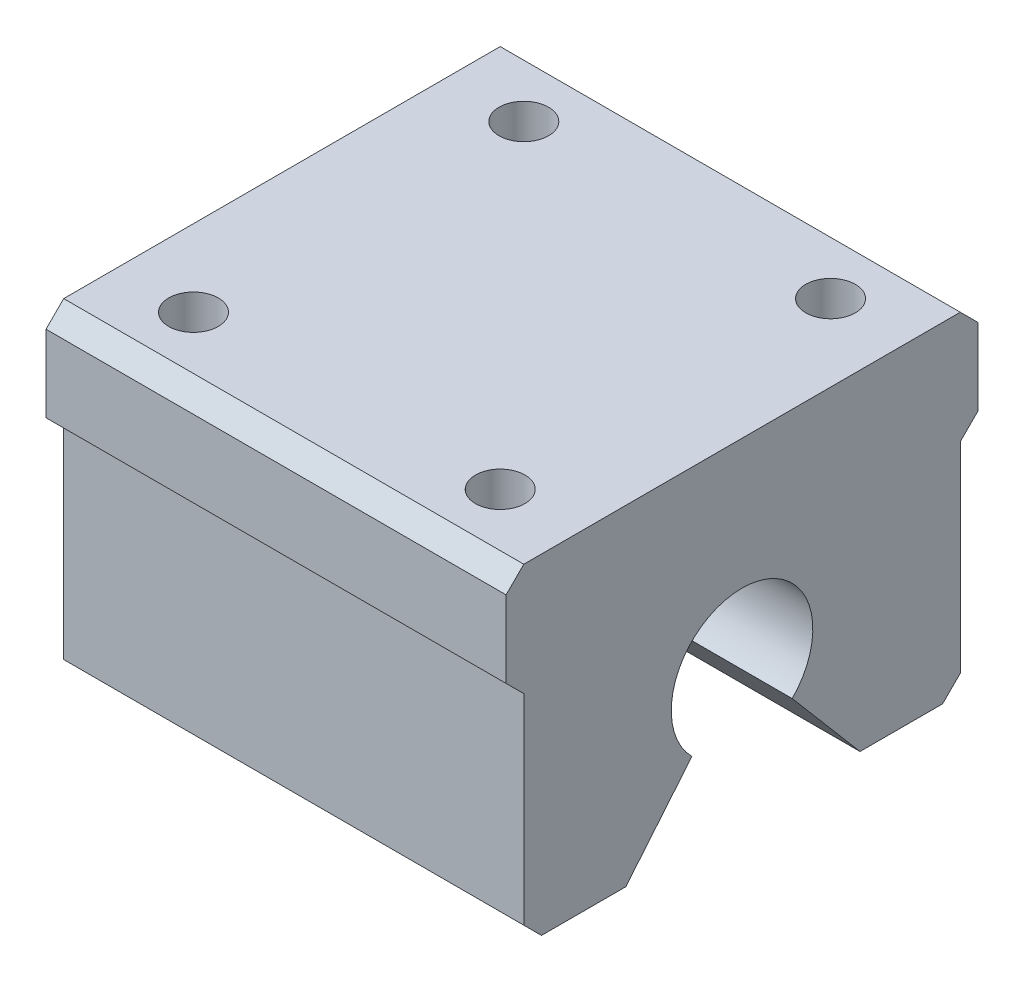
ISO-10303-21;
HEADER;
FILE_DESCRIPTION(('STEP AP214'),'2;1');
FILE_NAME('part.step','',(''),(''),'','','');
FILE_SCHEMA(('AUTOMOTIVE_DESIGN { 1 0 10303 214 1 1 1 1 }'));
ENDSEC;
DATA;
#1=APPLICATION_CONTEXT('core data for automotive mechanical design processes');
#2=APPLICATION_PROTOCOL_DEFINITION('international standard','automotive_design',2000,#1);
#3=PRODUCT_CONTEXT('',#1,'mechanical');
#4=PRODUCT('Part','Part','',(#3));
#5=PRODUCT_RELATED_PRODUCT_CATEGORY('part','',(#4));
#6=PRODUCT_DEFINITION_FORMATION('','',#4);
#7=PRODUCT_DEFINITION_CONTEXT('part definition',#1,'design');
#8=PRODUCT_DEFINITION('design','',#6,#7);
#9=PRODUCT_DEFINITION_SHAPE('','',#8);
#10=(LENGTH_UNIT() NAMED_UNIT(*) SI_UNIT(.MILLI.,.METRE.));
#11=(NAMED_UNIT(*) PLANE_ANGLE_UNIT() SI_UNIT($,.RADIAN.));
#12=(NAMED_UNIT(*) SI_UNIT($,.STERADIAN.) SOLID_ANGLE_UNIT());
#13=UNCERTAINTY_MEASURE_WITH_UNIT(LENGTH_MEASURE(1.E-05),#10,'distance_accuracy_value','');
#14=(GEOMETRIC_REPRESENTATION_CONTEXT(3) GLOBAL_UNCERTAINTY_ASSIGNED_CONTEXT((#13)) GLOBAL_UNIT_ASSIGNED_CONTEXT((#10,
#11,#12)) REPRESENTATION_CONTEXT('',''));
#15=CARTESIAN_POINT('',(0.,0.,0.));
#16=DIRECTION('',(0.,0.,1.));
#17=DIRECTION('',(1.,0.,0.));
#18=AXIS2_PLACEMENT_3D('',#15,#16,#17);
#19=CARTESIAN_POINT('',(-12.9498148707151,-18.5,-11.0177709614055));
#20=DIRECTION('',(0.,1.,0.));
#21=DIRECTION('',(0.,0.,1.));
#22=AXIS2_PLACEMENT_3D('',#19,#20,#21);
#23=PLANE('',#22);
#24=DIRECTION('',(0.,0.,-1.));
#25=VECTOR('',#24,1.);
#26=CARTESIAN_POINT('',(-12.9498148707151,-18.5,-11.0177709614055));
#27=LINE('',#26,#25);
#28=CARTESIAN_POINT('',(-12.9498148707151,-18.5,24.4822290385945));
#29=VERTEX_POINT('',#28);
#30=CARTESIAN_POINT('',(-12.9498148707151,-18.5,17.335579002308));
#31=VERTEX_POINT('',#30);
#32=EDGE_CURVE('E221',#29,#31,#27,.T.);
#33=ORIENTED_EDGE('',*,*,#32,.T.);
#34=DIRECTION('',(-1.,0.,0.));
#35=VECTOR('',#34,1.);
#36=CARTESIAN_POINT('',(26.0501851292849,-18.5,17.335579002308));
#37=LINE('',#36,#35);
#38=CARTESIAN_POINT('',(26.0501851292849,-18.5,17.335579002308));
#39=VERTEX_POINT('',#38);
#40=EDGE_CURVE('E188',#39,#31,#37,.T.);
#41=ORIENTED_EDGE('',*,*,#40,.F.);
#42=DIRECTION('',(0.,0.,1.));
#43=VECTOR('',#42,1.);
#44=CARTESIAN_POINT('',(26.0501851292849,-18.5,25.9822290385945));
#45=LINE('',#44,#43);
#46=CARTESIAN_POINT('',(26.0501851292849,-18.5,24.4822290385945));
#47=VERTEX_POINT('',#46);
#48=EDGE_CURVE('E217',#39,#47,#45,.T.);
#49=ORIENTED_EDGE('',*,*,#48,.T.);
#50=DIRECTION('',(-1.,0.,0.));
#51=VECTOR('',#50,1.);
#52=CARTESIAN_POINT('',(-12.9498148707151,-18.5,24.4822290385945));
#53=LINE('',#52,#51);
#54=EDGE_CURVE('E293',#47,#29,#53,.T.);
#55=ORIENTED_EDGE('',*,*,#54,.T.);
#56=EDGE_LOOP('',(#33,#41,#49,#55));
#57=FACE_BOUND('',#56,.T.);
#58=ADVANCED_FACE('F34',(#57),#23,.F.);
#59=CARTESIAN_POINT('',(-12.9498148707151,9.5,-12.5177709614055));
#60=DIRECTION('',(1.,0.,0.));
#61=DIRECTION('',(0.,0.,-1.));
#62=AXIS2_PLACEMENT_3D('',#59,#60,#61);
#63=PLANE('',#62);
#64=CARTESIAN_POINT('',(-12.9498148707151,-7.5,7.48222903859451));
#65=DIRECTION('',(-1.,0.,0.));
#66=DIRECTION('',(0.,0.,1.));
#67=AXIS2_PLACEMENT_3D('',#64,#65,#66);
#68=CIRCLE('',#67,6.);
#69=CARTESIAN_POINT('',(-12.9498148707151,-11.7352685865244,11.7322290385945));
#70=VERTEX_POINT('',#69);
#71=CARTESIAN_POINT('',(-12.9498148707151,-11.7352685865244,3.2322290385945));
#72=VERTEX_POINT('',#71);
#73=EDGE_CURVE('E166',#70,#72,#68,.T.);
#74=ORIENTED_EDGE('',*,*,#73,.F.);
#75=DIRECTION('',(0.,0.770117371311629,-0.637902213825965));
#76=VECTOR('',#75,1.);
#77=CARTESIAN_POINT('',(-12.9498148707151,-11.7352685865244,11.7322290385945));
#78=LINE('',#77,#76);
#79=EDGE_CURVE('E177',#31,#70,#78,.T.);
#80=ORIENTED_EDGE('',*,*,#79,.F.);
#81=ORIENTED_EDGE('',*,*,#32,.F.);
#82=DIRECTION('',(0.,-0.707106781186549,-0.707106781186546));
#83=VECTOR('',#82,1.);
#84=CARTESIAN_POINT('',(-12.9498148707151,-18.5,24.4822290385945));
#85=LINE('',#84,#83);
#86=CARTESIAN_POINT('',(-12.9498148707151,-17.,25.9822290385945));
#87=VERTEX_POINT('',#86);
#88=EDGE_CURVE('E299',#29,#87,#85,.F.);
#89=ORIENTED_EDGE('',*,*,#88,.T.);
#90=DIRECTION('',(0.,1.,0.));
#91=VECTOR('',#90,1.);
#92=CARTESIAN_POINT('',(-12.9498148707151,-18.5,25.9822290385945));
#93=LINE('',#92,#91);
#94=CARTESIAN_POINT('',(-12.9498148707151,0.,25.9822290385945));
#95=VERTEX_POINT('',#94);
#96=EDGE_CURVE('E226',#87,#95,#93,.T.);
#97=ORIENTED_EDGE('',*,*,#96,.T.);
#98=DIRECTION('',(0.,-0.707106781186546,-0.707106781186549));
#99=VECTOR('',#98,1.);
#100=CARTESIAN_POINT('',(-12.9498148707151,1.5,27.4822290385945));
#101=LINE('',#100,#99);
#102=CARTESIAN_POINT('',(-12.9498148707151,1.5,27.4822290385945));
#103=VERTEX_POINT('',#102);
#104=EDGE_CURVE('E259',#95,#103,#101,.F.);
#105=ORIENTED_EDGE('',*,*,#104,.T.);
#106=DIRECTION('',(0.,-1.,0.));
#107=VECTOR('',#106,1.);
#108=CARTESIAN_POINT('',(-12.9498148707151,9.5,27.4822290385945));
#109=LINE('',#108,#107);
#110=CARTESIAN_POINT('',(-12.9498148707151,8.,27.4822290385945));
#111=VERTEX_POINT('',#110);
#112=EDGE_CURVE('E247',#111,#103,#109,.T.);
#113=ORIENTED_EDGE('',*,*,#112,.F.);
#114=DIRECTION('',(0.,0.707106781186549,-0.707106781186546));
#115=VECTOR('',#114,1.);
#116=CARTESIAN_POINT('',(-12.9498148707151,9.5,25.9822290385945));
#117=LINE('',#116,#115);
#118=CARTESIAN_POINT('',(-12.9498148707151,9.5,25.9822290385945));
#119=VERTEX_POINT('',#118);
#120=EDGE_CURVE('E257',#111,#119,#117,.T.);
#121=ORIENTED_EDGE('',*,*,#120,.T.);
#122=DIRECTION('',(0.,0.,1.));
#123=VECTOR('',#122,1.);
#124=CARTESIAN_POINT('',(-12.9498148707151,9.5,-12.5177709614055));
#125=LINE('',#124,#123);
#126=CARTESIAN_POINT('',(-12.9498148707151,9.5,-11.0177709614055));
#127=VERTEX_POINT('',#126);
#128=EDGE_CURVE('E232',#127,#119,#125,.T.);
#129=ORIENTED_EDGE('',*,*,#128,.F.);
#130=DIRECTION('',(0.,-0.707106781186549,-0.707106781186546));
#131=VECTOR('',#130,1.);
#132=CARTESIAN_POINT('',(-12.9498148707151,9.5,-11.0177709614055));
#133=LINE('',#132,#131);
#134=CARTESIAN_POINT('',(-12.9498148707151,7.99999999999999,-12.5177709614055));
#135=VERTEX_POINT('',#134);
#136=EDGE_CURVE('E255',#127,#135,#133,.T.);
#137=ORIENTED_EDGE('',*,*,#136,.T.);
#138=DIRECTION('',(0.,-1.,0.));
#139=VECTOR('',#138,1.);
#140=CARTESIAN_POINT('',(-12.9498148707151,9.5,-12.5177709614055));
#141=LINE('',#140,#139);
#142=CARTESIAN_POINT('',(-12.9498148707151,1.5,-12.5177709614055));
#143=VERTEX_POINT('',#142);
#144=EDGE_CURVE('E238',#135,#143,#141,.T.);
#145=ORIENTED_EDGE('',*,*,#144,.T.);
#146=DIRECTION('',(0.,0.707106781186546,-0.707106781186549));
#147=VECTOR('',#146,1.);
#148=CARTESIAN_POINT('',(-12.9498148707151,1.5,-12.5177709614055));
#149=LINE('',#148,#147);
#150=CARTESIAN_POINT('',(-12.9498148707151,0.,-11.0177709614055));
#151=VERTEX_POINT('',#150);
#152=EDGE_CURVE('E261',#143,#151,#149,.F.);
#153=ORIENTED_EDGE('',*,*,#152,.T.);
#154=DIRECTION('',(0.,1.,0.));
#155=VECTOR('',#154,1.);
#156=CARTESIAN_POINT('',(-12.9498148707151,-18.5,-11.0177709614055));
#157=LINE('',#156,#155);
#158=CARTESIAN_POINT('',(-12.9498148707151,-17.,-11.0177709614055));
#159=VERTEX_POINT('',#158);
#160=EDGE_CURVE('E224',#159,#151,#157,.T.);
#161=ORIENTED_EDGE('',*,*,#160,.F.);
#162=DIRECTION('',(0.,0.707106781186548,-0.707106781186548));
#163=VECTOR('',#162,1.);
#164=CARTESIAN_POINT('',(-12.9498148707151,-18.5,-9.51777096140548));
#165=LINE('',#164,#163);
#166=CARTESIAN_POINT('',(-12.9498148707151,-18.5,-9.51777096140548));
#167=VERTEX_POINT('',#166);
#168=EDGE_CURVE('E296',#159,#167,#165,.F.);
#169=ORIENTED_EDGE('',*,*,#168,.T.);
#170=CARTESIAN_POINT('',(-12.9498148707151,-18.5,-2.51777096140549));
#171=VERTEX_POINT('',#170);
#172=EDGE_CURVE('E220',#171,#167,#27,.T.);
#173=ORIENTED_EDGE('',*,*,#172,.F.);
#174=DIRECTION('',(0.,-0.761940523957371,-0.647647001036496));
#175=VECTOR('',#174,1.);
#176=CARTESIAN_POINT('',(-12.9498148707151,-11.7352685865244,3.2322290385945));
#177=LINE('',#176,#175);
#178=EDGE_CURVE('E49',#72,#171,#177,.T.);
#179=ORIENTED_EDGE('',*,*,#178,.F.);
#180=EDGE_LOOP('',(#74,#80,#81,#89,#97,#105,#113,#121,#129,#137,#145,#153,#161,#169,#173,#179));
#181=FACE_BOUND('',#180,.T.);
#182=ADVANCED_FACE('F329',(#181),#63,.F.);
#183=CARTESIAN_POINT('',(-12.9498148707151,9.5,27.4822290385945));
#184=DIRECTION('',(0.,0.,-1.));
#185=DIRECTION('',(-1.,0.,0.));
#186=AXIS2_PLACEMENT_3D('',#183,#184,#185);
#187=PLANE('',#186);
#188=ORIENTED_EDGE('',*,*,#112,.T.);
#189=DIRECTION('',(1.,0.,0.));
#190=VECTOR('',#189,1.);
#191=CARTESIAN_POINT('',(-12.9498148707151,1.5,27.4822290385945));
#192=LINE('',#191,#190);
#193=CARTESIAN_POINT('',(26.0501851292849,1.5,27.4822290385945));
#194=VERTEX_POINT('',#193);
#195=EDGE_CURVE('E281',#103,#194,#192,.T.);
#196=ORIENTED_EDGE('',*,*,#195,.T.);
#197=DIRECTION('',(0.,-1.,0.));
#198=VECTOR('',#197,1.);
#199=CARTESIAN_POINT('',(26.0501851292849,9.5,27.4822290385945));
#200=LINE('',#199,#198);
#201=CARTESIAN_POINT('',(26.0501851292849,8.,27.4822290385945));
#202=VERTEX_POINT('',#201);
#203=EDGE_CURVE('E244',#202,#194,#200,.T.);
#204=ORIENTED_EDGE('',*,*,#203,.F.);
#205=DIRECTION('',(-1.,0.,0.));
#206=VECTOR('',#205,1.);
#207=CARTESIAN_POINT('',(-12.9498148707151,8.,27.4822290385945));
#208=LINE('',#207,#206);
#209=EDGE_CURVE('E279',#202,#111,#208,.T.);
#210=ORIENTED_EDGE('',*,*,#209,.T.);
#211=EDGE_LOOP('',(#188,#196,#204,#210));
#212=FACE_BOUND('',#211,.T.);
#213=ADVANCED_FACE('F336',(#212),#187,.F.);
#214=CARTESIAN_POINT('',(26.0501851292849,9.5,-12.5177709614055));
#215=DIRECTION('',(-1.,0.,0.));
#216=DIRECTION('',(0.,0.,1.));
#217=AXIS2_PLACEMENT_3D('',#214,#215,#216);
#218=PLANE('',#217);
#219=ORIENTED_EDGE('',*,*,#48,.F.);
#220=DIRECTION('',(0.,0.770117371311629,-0.637902213825965));
#221=VECTOR('',#220,1.);
#222=CARTESIAN_POINT('',(26.0501851292849,-11.7352685865244,11.7322290385945));
#223=LINE('',#222,#221);
#224=CARTESIAN_POINT('',(26.0501851292849,-11.7352685865244,11.7322290385945));
#225=VERTEX_POINT('',#224);
#226=EDGE_CURVE('E168',#39,#225,#223,.T.);
#227=ORIENTED_EDGE('',*,*,#226,.T.);
#228=CARTESIAN_POINT('',(26.0501851292849,-7.5,7.4822290385945));
#229=DIRECTION('',(-1.,0.,0.));
#230=DIRECTION('',(0.,0.,1.));
#231=AXIS2_PLACEMENT_3D('',#228,#229,#230);
#232=CIRCLE('',#231,6.);
#233=CARTESIAN_POINT('',(26.0501851292849,-11.7352685865244,3.2322290385945));
#234=VERTEX_POINT('',#233);
#235=EDGE_CURVE('E163',#225,#234,#232,.T.);
#236=ORIENTED_EDGE('',*,*,#235,.T.);
#237=DIRECTION('',(0.,-0.761940523957371,-0.647647001036496));
#238=VECTOR('',#237,1.);
#239=CARTESIAN_POINT('',(26.0501851292849,-11.7352685865244,3.2322290385945));
#240=LINE('',#239,#238);
#241=CARTESIAN_POINT('',(26.0501851292849,-18.5,-2.5177709614055));
#242=VERTEX_POINT('',#241);
#243=EDGE_CURVE('E171',#234,#242,#240,.T.);
#244=ORIENTED_EDGE('',*,*,#243,.T.);
#245=CARTESIAN_POINT('',(26.0501851292849,-18.5,-9.51777096140547));
#246=VERTEX_POINT('',#245);
#247=EDGE_CURVE('E218',#246,#242,#45,.T.);
#248=ORIENTED_EDGE('',*,*,#247,.F.);
#249=DIRECTION('',(0.,-0.707106781186548,0.707106781186548));
#250=VECTOR('',#249,1.);
#251=CARTESIAN_POINT('',(26.0501851292849,-18.5,-9.51777096140548));
#252=LINE('',#251,#250);
#253=CARTESIAN_POINT('',(26.0501851292849,-17.,-11.0177709614055));
#254=VERTEX_POINT('',#253);
#255=EDGE_CURVE('E57',#246,#254,#252,.F.);
#256=ORIENTED_EDGE('',*,*,#255,.T.);
#257=DIRECTION('',(0.,1.,0.));
#258=VECTOR('',#257,1.);
#259=CARTESIAN_POINT('',(26.0501851292849,-18.5,-11.0177709614055));
#260=LINE('',#259,#258);
#261=CARTESIAN_POINT('',(26.0501851292849,0.,-11.0177709614055));
#262=VERTEX_POINT('',#261);
#263=EDGE_CURVE('E230',#254,#262,#260,.T.);
#264=ORIENTED_EDGE('',*,*,#263,.T.);
#265=DIRECTION('',(0.,-0.707106781186546,0.707106781186549));
#266=VECTOR('',#265,1.);
#267=CARTESIAN_POINT('',(26.0501851292849,1.5,-12.5177709614055));
#268=LINE('',#267,#266);
#269=CARTESIAN_POINT('',(26.0501851292849,1.5,-12.5177709614055));
#270=VERTEX_POINT('',#269);
#271=EDGE_CURVE('E277',#262,#270,#268,.F.);
#272=ORIENTED_EDGE('',*,*,#271,.T.);
#273=DIRECTION('',(0.,-1.,0.));
#274=VECTOR('',#273,1.);
#275=CARTESIAN_POINT('',(26.0501851292849,9.5,-12.5177709614055));
#276=LINE('',#275,#274);
#277=CARTESIAN_POINT('',(26.0501851292849,7.99999999999999,-12.5177709614055));
#278=VERTEX_POINT('',#277);
#279=EDGE_CURVE('E241',#278,#270,#276,.T.);
#280=ORIENTED_EDGE('',*,*,#279,.F.);
#281=DIRECTION('',(0.,0.707106781186549,0.707106781186546));
#282=VECTOR('',#281,1.);
#283=CARTESIAN_POINT('',(26.0501851292849,9.5,-11.0177709614055));
#284=LINE('',#283,#282);
#285=CARTESIAN_POINT('',(26.0501851292849,9.5,-11.0177709614055));
#286=VERTEX_POINT('',#285);
#287=EDGE_CURVE('E270',#278,#286,#284,.T.);
#288=ORIENTED_EDGE('',*,*,#287,.T.);
#289=DIRECTION('',(0.,0.,-1.));
#290=VECTOR('',#289,1.);
#291=CARTESIAN_POINT('',(26.0501851292849,9.5,-12.5177709614055));
#292=LINE('',#291,#290);
#293=CARTESIAN_POINT('',(26.0501851292849,9.5,25.9822290385945));
#294=VERTEX_POINT('',#293);
#295=EDGE_CURVE('E235',#294,#286,#292,.T.);
#296=ORIENTED_EDGE('',*,*,#295,.F.);
#297=DIRECTION('',(0.,-0.707106781186549,0.707106781186546));
#298=VECTOR('',#297,1.);
#299=CARTESIAN_POINT('',(26.0501851292849,9.5,25.9822290385945));
#300=LINE('',#299,#298);
#301=EDGE_CURVE('E272',#294,#202,#300,.T.);
#302=ORIENTED_EDGE('',*,*,#301,.T.);
#303=ORIENTED_EDGE('',*,*,#203,.T.);
#304=DIRECTION('',(0.,0.707106781186546,0.707106781186549));
#305=VECTOR('',#304,1.);
#306=CARTESIAN_POINT('',(26.0501851292849,1.5,27.4822290385945));
#307=LINE('',#306,#305);
#308=CARTESIAN_POINT('',(26.0501851292849,0.,25.9822290385945));
#309=VERTEX_POINT('',#308);
#310=EDGE_CURVE('E274',#194,#309,#307,.F.);
#311=ORIENTED_EDGE('',*,*,#310,.T.);
#312=DIRECTION('',(0.,1.,0.));
#313=VECTOR('',#312,1.);
#314=CARTESIAN_POINT('',(26.0501851292849,-18.5,25.9822290385945));
#315=LINE('',#314,#313);
#316=CARTESIAN_POINT('',(26.0501851292849,-17.,25.9822290385945));
#317=VERTEX_POINT('',#316);
#318=EDGE_CURVE('E228',#317,#309,#315,.T.);
#319=ORIENTED_EDGE('',*,*,#318,.F.);
#320=DIRECTION('',(0.,0.707106781186549,0.707106781186546));
#321=VECTOR('',#320,1.);
#322=CARTESIAN_POINT('',(26.0501851292849,-18.5,24.4822290385945));
#323=LINE('',#322,#321);
#324=EDGE_CURVE('E304',#317,#47,#323,.F.);
#325=ORIENTED_EDGE('',*,*,#324,.T.);
#326=EDGE_LOOP('',(#219,#227,#236,#244,#248,#256,#264,#272,#280,#288,#296,#302,#303,#311,#319,#325));
#327=FACE_BOUND('',#326,.T.);
#328=ADVANCED_FACE('F176',(#327),#218,.F.);
#329=CARTESIAN_POINT('',(-12.9498148707151,9.5,-12.5177709614055));
#330=DIRECTION('',(0.,0.,1.));
#331=DIRECTION('',(1.,0.,0.));
#332=AXIS2_PLACEMENT_3D('',#329,#330,#331);
#333=PLANE('',#332);
#334=ORIENTED_EDGE('',*,*,#279,.T.);
#335=DIRECTION('',(-1.,0.,0.));
#336=VECTOR('',#335,1.);
#337=CARTESIAN_POINT('',(-12.9498148707151,1.5,-12.5177709614055));
#338=LINE('',#337,#336);
#339=EDGE_CURVE('E252',#270,#143,#338,.T.);
#340=ORIENTED_EDGE('',*,*,#339,.T.);
#341=ORIENTED_EDGE('',*,*,#144,.F.);
#342=DIRECTION('',(1.,0.,0.));
#343=VECTOR('',#342,1.);
#344=CARTESIAN_POINT('',(26.0501851292849,7.99999999999999,-12.5177709614055));
#345=LINE('',#344,#343);
#346=EDGE_CURVE('E250',#135,#278,#345,.T.);
#347=ORIENTED_EDGE('',*,*,#346,.T.);
#348=EDGE_LOOP('',(#334,#340,#341,#347));
#349=FACE_BOUND('',#348,.T.);
#350=ADVANCED_FACE('F370',(#349),#333,.F.);
#351=CARTESIAN_POINT('',(-12.9498148707151,9.5,27.4822290385945));
#352=DIRECTION('',(0.,1.,0.));
#353=DIRECTION('',(0.,0.,1.));
#354=AXIS2_PLACEMENT_3D('',#351,#352,#353);
#355=PLANE('',#354);
#356=CARTESIAN_POINT('',(-6.44981487071515,9.5,-6.51777096140549));
#357=DIRECTION('',(0.,1.,0.));
#358=DIRECTION('',(0.,0.,1.));
#359=AXIS2_PLACEMENT_3D('',#356,#357,#358);
#360=CIRCLE('',#359,2.1);
#361=CARTESIAN_POINT('',(-6.44981487071515,9.5,-4.41777096140549));
#362=VERTEX_POINT('',#361);
#363=EDGE_CURVE('E187',#362,#362,#360,.T.);
#364=ORIENTED_EDGE('',*,*,#363,.F.);
#365=EDGE_LOOP('',(#364));
#366=FACE_BOUND('',#365,.T.);
#367=CARTESIAN_POINT('',(19.5501851292849,9.5,-6.51777096140549));
#368=DIRECTION('',(0.,1.,0.));
#369=DIRECTION('',(0.,0.,1.));
#370=AXIS2_PLACEMENT_3D('',#367,#368,#369);
#371=CIRCLE('',#370,2.1);
#372=CARTESIAN_POINT('',(19.5501851292849,9.5,-4.41777096140549));
#373=VERTEX_POINT('',#372);
#374=EDGE_CURVE('E196',#373,#373,#371,.T.);
#375=ORIENTED_EDGE('',*,*,#374,.F.);
#376=EDGE_LOOP('',(#375));
#377=FACE_BOUND('',#376,.T.);
#378=CARTESIAN_POINT('',(19.5501851292849,9.5,21.4822290385945));
#379=DIRECTION('',(0.,1.,0.));
#380=DIRECTION('',(0.,0.,1.));
#381=AXIS2_PLACEMENT_3D('',#378,#379,#380);
#382=CIRCLE('',#381,2.1);
#383=CARTESIAN_POINT('',(19.5501851292849,9.5,23.5822290385945));
#384=VERTEX_POINT('',#383);
#385=EDGE_CURVE('E202',#384,#384,#382,.T.);
#386=ORIENTED_EDGE('',*,*,#385,.F.);
#387=EDGE_LOOP('',(#386));
#388=FACE_BOUND('',#387,.T.);
#389=CARTESIAN_POINT('',(-6.44981487071515,9.5,21.4822290385945));
#390=DIRECTION('',(0.,1.,0.));
#391=DIRECTION('',(0.,0.,1.));
#392=AXIS2_PLACEMENT_3D('',#389,#390,#391);
#393=CIRCLE('',#392,2.1);
#394=CARTESIAN_POINT('',(-6.44981487071515,9.5,23.5822290385945));
#395=VERTEX_POINT('',#394);
#396=EDGE_CURVE('E208',#395,#395,#393,.T.);
#397=ORIENTED_EDGE('',*,*,#396,.F.);
#398=EDGE_LOOP('',(#397));
#399=FACE_BOUND('',#398,.T.);
#400=ORIENTED_EDGE('',*,*,#128,.T.);
#401=DIRECTION('',(1.,0.,0.));
#402=VECTOR('',#401,1.);
#403=CARTESIAN_POINT('',(26.0501851292849,9.5,25.9822290385945));
#404=LINE('',#403,#402);
#405=EDGE_CURVE('E287',#119,#294,#404,.T.);
#406=ORIENTED_EDGE('',*,*,#405,.T.);
#407=ORIENTED_EDGE('',*,*,#295,.T.);
#408=DIRECTION('',(-1.,0.,0.));
#409=VECTOR('',#408,1.);
#410=CARTESIAN_POINT('',(-12.9498148707151,9.5,-11.0177709614055));
#411=LINE('',#410,#409);
#412=EDGE_CURVE('E284',#286,#127,#411,.T.);
#413=ORIENTED_EDGE('',*,*,#412,.T.);
#414=EDGE_LOOP('',(#400,#406,#407,#413));
#415=FACE_BOUND('',#414,.T.);
#416=ADVANCED_FACE('F377',(#366,#377,#388,#399,#415),#355,.T.);
#417=CARTESIAN_POINT('',(-12.9498148707151,1.5,-12.5177709614055));
#418=DIRECTION('',(0.,0.707106781186549,0.707106781186546));
#419=DIRECTION('',(0.,-0.707106781186546,0.707106781186549));
#420=AXIS2_PLACEMENT_3D('',#417,#418,#419);
#421=PLANE('',#420);
#422=ORIENTED_EDGE('',*,*,#271,.F.);
#423=DIRECTION('',(1.,0.,0.));
#424=VECTOR('',#423,1.);
#425=CARTESIAN_POINT('',(-12.9498148707151,0.,-11.0177709614055));
#426=LINE('',#425,#424);
#427=EDGE_CURVE('E267',#151,#262,#426,.T.);
#428=ORIENTED_EDGE('',*,*,#427,.F.);
#429=ORIENTED_EDGE('',*,*,#152,.F.);
#430=ORIENTED_EDGE('',*,*,#339,.F.);
#431=EDGE_LOOP('',(#422,#428,#429,#430));
#432=FACE_BOUND('',#431,.T.);
#433=ADVANCED_FACE('F366',(#432),#421,.F.);
#434=CARTESIAN_POINT('',(-12.9498148707151,1.5,27.4822290385945));
#435=DIRECTION('',(0.,0.707106781186549,-0.707106781186546));
#436=DIRECTION('',(0.,0.707106781186546,0.707106781186549));
#437=AXIS2_PLACEMENT_3D('',#434,#435,#436);
#438=PLANE('',#437);
#439=ORIENTED_EDGE('',*,*,#104,.F.);
#440=DIRECTION('',(-1.,0.,0.));
#441=VECTOR('',#440,1.);
#442=CARTESIAN_POINT('',(-12.9498148707151,0.,25.9822290385945));
#443=LINE('',#442,#441);
#444=EDGE_CURVE('E264',#309,#95,#443,.T.);
#445=ORIENTED_EDGE('',*,*,#444,.F.);
#446=ORIENTED_EDGE('',*,*,#310,.F.);
#447=ORIENTED_EDGE('',*,*,#195,.F.);
#448=EDGE_LOOP('',(#439,#445,#446,#447));
#449=FACE_BOUND('',#448,.T.);
#450=ADVANCED_FACE('F390',(#449),#438,.F.);
#451=CARTESIAN_POINT('',(-12.9498148707151,9.5,25.9822290385945));
#452=DIRECTION('',(0.,0.707106781186546,0.707106781186549));
#453=DIRECTION('',(0.,-0.707106781186549,0.707106781186546));
#454=AXIS2_PLACEMENT_3D('',#451,#452,#453);
#455=PLANE('',#454);
#456=ORIENTED_EDGE('',*,*,#120,.F.);
#457=ORIENTED_EDGE('',*,*,#209,.F.);
#458=ORIENTED_EDGE('',*,*,#301,.F.);
#459=ORIENTED_EDGE('',*,*,#405,.F.);
#460=EDGE_LOOP('',(#456,#457,#458,#459));
#461=FACE_BOUND('',#460,.T.);
#462=ADVANCED_FACE('F382',(#461),#455,.T.);
#463=CARTESIAN_POINT('',(-12.9498148707151,9.5,-11.0177709614055));
#464=DIRECTION('',(0.,0.707106781186546,-0.707106781186549));
#465=DIRECTION('',(0.,0.707106781186549,0.707106781186546));
#466=AXIS2_PLACEMENT_3D('',#463,#464,#465);
#467=PLANE('',#466);
#468=ORIENTED_EDGE('',*,*,#287,.F.);
#469=ORIENTED_EDGE('',*,*,#346,.F.);
#470=ORIENTED_EDGE('',*,*,#136,.F.);
#471=ORIENTED_EDGE('',*,*,#412,.F.);
#472=EDGE_LOOP('',(#468,#469,#470,#471));
#473=FACE_BOUND('',#472,.T.);
#474=ADVANCED_FACE('F373',(#473),#467,.T.);
#475=CARTESIAN_POINT('',(26.0501851292849,-18.5,-11.0177709614055));
#476=DIRECTION('',(0.,0.,1.));
#477=DIRECTION('',(1.,0.,0.));
#478=AXIS2_PLACEMENT_3D('',#475,#476,#477);
#479=PLANE('',#478);
#480=CARTESIAN_POINT('',(6.05018512928486,-9.,-11.0177709614055));
#481=DIRECTION('',(0.,0.,1.));
#482=DIRECTION('',(1.,0.,0.));
#483=AXIS2_PLACEMENT_3D('',#480,#481,#482);
#484=CIRCLE('',#483,3.75000000000001);
#485=CARTESIAN_POINT('',(9.80018512928487,-9.,-11.0177709614055));
#486=VERTEX_POINT('',#485);
#487=EDGE_CURVE('E11',#486,#486,#484,.T.);
#488=ORIENTED_EDGE('',*,*,#487,.T.);
#489=EDGE_LOOP('',(#488));
#490=FACE_BOUND('',#489,.T.);
#491=ORIENTED_EDGE('',*,*,#263,.F.);
#492=DIRECTION('',(-1.,0.,0.));
#493=VECTOR('',#492,1.);
#494=CARTESIAN_POINT('',(26.0501851292849,-17.,-11.0177709614055));
#495=LINE('',#494,#493);
#496=EDGE_CURVE('E307',#254,#159,#495,.T.);
#497=ORIENTED_EDGE('',*,*,#496,.T.);
#498=ORIENTED_EDGE('',*,*,#160,.T.);
#499=ORIENTED_EDGE('',*,*,#427,.T.);
#500=EDGE_LOOP('',(#491,#497,#498,#499));
#501=FACE_BOUND('',#500,.T.);
#502=ADVANCED_FACE('F352',(#490,#501),#479,.F.);
#503=CARTESIAN_POINT('',(-12.9498148707151,-18.5,25.9822290385945));
#504=DIRECTION('',(0.,0.,-1.));
#505=DIRECTION('',(-1.,0.,0.));
#506=AXIS2_PLACEMENT_3D('',#503,#504,#505);
#507=PLANE('',#506);
#508=ORIENTED_EDGE('',*,*,#96,.F.);
#509=DIRECTION('',(1.,0.,0.));
#510=VECTOR('',#509,1.);
#511=CARTESIAN_POINT('',(-12.9498148707151,-17.,25.9822290385945));
#512=LINE('',#511,#510);
#513=EDGE_CURVE('E301',#87,#317,#512,.T.);
#514=ORIENTED_EDGE('',*,*,#513,.T.);
#515=ORIENTED_EDGE('',*,*,#318,.T.);
#516=ORIENTED_EDGE('',*,*,#444,.T.);
#517=EDGE_LOOP('',(#508,#514,#515,#516));
#518=FACE_BOUND('',#517,.T.);
#519=ADVANCED_FACE('F343',(#518),#507,.F.);
#520=ORIENTED_EDGE('',*,*,#247,.T.);
#521=DIRECTION('',(-1.,0.,0.));
#522=VECTOR('',#521,1.);
#523=CARTESIAN_POINT('',(26.0501851292849,-18.5,-2.5177709614055));
#524=LINE('',#523,#522);
#525=EDGE_CURVE('E167',#242,#171,#524,.T.);
#526=ORIENTED_EDGE('',*,*,#525,.T.);
#527=ORIENTED_EDGE('',*,*,#172,.T.);
#528=DIRECTION('',(1.,0.,0.));
#529=VECTOR('',#528,1.);
#530=CARTESIAN_POINT('',(-12.9498148707151,-18.5,-9.51777096140548));
#531=LINE('',#530,#529);
#532=EDGE_CURVE('E290',#167,#246,#531,.T.);
#533=ORIENTED_EDGE('',*,*,#532,.T.);
#534=EDGE_LOOP('',(#520,#526,#527,#533));
#535=FACE_BOUND('',#534,.T.);
#536=ADVANCED_FACE('F332',(#535),#23,.F.);
#537=CARTESIAN_POINT('',(-12.9498148707151,-18.5,24.4822290385945));
#538=DIRECTION('',(0.,0.707106781186546,-0.707106781186549));
#539=DIRECTION('',(0.,0.707106781186549,0.707106781186546));
#540=AXIS2_PLACEMENT_3D('',#537,#538,#539);
#541=PLANE('',#540);
#542=ORIENTED_EDGE('',*,*,#324,.F.);
#543=ORIENTED_EDGE('',*,*,#513,.F.);
#544=ORIENTED_EDGE('',*,*,#88,.F.);
#545=ORIENTED_EDGE('',*,*,#54,.F.);
#546=EDGE_LOOP('',(#542,#543,#544,#545));
#547=FACE_BOUND('',#546,.T.);
#548=ADVANCED_FACE('F342',(#547),#541,.F.);
#549=CARTESIAN_POINT('',(-12.9498148707151,-18.5,-9.51777096140548));
#550=DIRECTION('',(0.,0.707106781186548,0.707106781186548));
#551=DIRECTION('',(0.,-0.707106781186548,0.707106781186548));
#552=AXIS2_PLACEMENT_3D('',#549,#550,#551);
#553=PLANE('',#552);
#554=ORIENTED_EDGE('',*,*,#168,.F.);
#555=ORIENTED_EDGE('',*,*,#496,.F.);
#556=ORIENTED_EDGE('',*,*,#255,.F.);
#557=ORIENTED_EDGE('',*,*,#532,.F.);
#558=EDGE_LOOP('',(#554,#555,#556,#557));
#559=FACE_BOUND('',#558,.T.);
#560=ADVANCED_FACE('F349',(#559),#553,.F.);
#561=CARTESIAN_POINT('',(6.05018512928486,-9.,-6.01777096140549));
#562=DIRECTION('',(0.,0.,-1.));
#563=DIRECTION('',(-1.,0.,0.));
#564=AXIS2_PLACEMENT_3D('',#561,#562,#563);
#565=CYLINDRICAL_SURFACE('',#564,2.75);
#566=CARTESIAN_POINT('',(6.05018512928486,-9.,-10.0177709614055));
#567=DIRECTION('',(0.,0.,1.));
#568=DIRECTION('',(1.,0.,0.));
#569=AXIS2_PLACEMENT_3D('',#566,#567,#568);
#570=CIRCLE('',#569,2.75);
#571=CARTESIAN_POINT('',(8.80018512928486,-9.,-10.0177709614055));
#572=VERTEX_POINT('',#571);
#573=EDGE_CURVE('E42',#572,#572,#570,.F.);
#574=ORIENTED_EDGE('',*,*,#573,.T.);
#575=EDGE_LOOP('',(#574));
#576=FACE_BOUND('',#575,.T.);
#577=CARTESIAN_POINT('',(6.05018512928486,-9.,-6.01777096140549));
#578=DIRECTION('',(0.,0.,-1.));
#579=DIRECTION('',(-1.,0.,0.));
#580=AXIS2_PLACEMENT_3D('',#577,#578,#579);
#581=CIRCLE('',#580,2.75);
#582=CARTESIAN_POINT('',(3.30018512928486,-9.,-6.01777096140549));
#583=VERTEX_POINT('',#582);
#584=EDGE_CURVE('E214',#583,#583,#581,.T.);
#585=ORIENTED_EDGE('',*,*,#584,.F.);
#586=EDGE_LOOP('',(#585));
#587=FACE_BOUND('',#586,.T.);
#588=ADVANCED_FACE('F311',(#576,#587),#565,.F.);
#589=CARTESIAN_POINT('',(6.05018512928486,-9.,-6.01777096140549));
#590=DIRECTION('',(0.,0.,-1.));
#591=DIRECTION('',(-1.,0.,0.));
#592=AXIS2_PLACEMENT_3D('',#589,#590,#591);
#593=PLANE('',#592);
#594=ORIENTED_EDGE('',*,*,#584,.T.);
#595=EDGE_LOOP('',(#594));
#596=FACE_BOUND('',#595,.T.);
#597=ADVANCED_FACE('F316',(#596),#593,.T.);
#598=CARTESIAN_POINT('',(6.05018512928486,-9.,-10.0177709614055));
#599=DIRECTION('',(0.,0.,-1.));
#600=DIRECTION('',(-1.,0.,0.));
#601=AXIS2_PLACEMENT_3D('',#598,#599,#600);
#602=CONICAL_SURFACE('',#601,2.75,0.78539816339745);
#603=ORIENTED_EDGE('',*,*,#487,.F.);
#604=EDGE_LOOP('',(#603));
#605=FACE_BOUND('',#604,.T.);
#606=ORIENTED_EDGE('',*,*,#573,.F.);
#607=EDGE_LOOP('',(#606));
#608=FACE_BOUND('',#607,.T.);
#609=ADVANCED_FACE('F36',(#605,#608),#602,.F.);
#610=CARTESIAN_POINT('',(-6.44981487071515,-2.9,21.4822290385945));
#611=DIRECTION('',(0.,1.,0.));
#612=DIRECTION('',(0.,0.,1.));
#613=AXIS2_PLACEMENT_3D('',#610,#611,#612);
#614=CONICAL_SURFACE('',#613,2.1,1.02974425867665);
#615=CARTESIAN_POINT('',(-6.44981487071515,-4.16180729995788,21.4822290385945));
#616=VERTEX_POINT('',#615);
#617=VERTEX_LOOP('',#616);
#618=FACE_BOUND('',#617,.T.);
#619=CARTESIAN_POINT('',(-6.44981487071515,-2.9,21.4822290385945));
#620=DIRECTION('',(0.,1.,0.));
#621=DIRECTION('',(0.,0.,1.));
#622=AXIS2_PLACEMENT_3D('',#619,#620,#621);
#623=CIRCLE('',#622,2.1);
#624=CARTESIAN_POINT('',(-6.44981487071515,-2.9,23.5822290385945));
#625=VERTEX_POINT('',#624);
#626=EDGE_CURVE('E211',#625,#625,#623,.T.);
#627=ORIENTED_EDGE('',*,*,#626,.T.);
#628=EDGE_LOOP('',(#627));
#629=FACE_BOUND('',#628,.T.);
#630=ADVANCED_FACE('F315',(#618,#629),#614,.F.);
#631=CARTESIAN_POINT('',(-6.44981487071515,9.5,21.4822290385945));
#632=DIRECTION('',(0.,1.,0.));
#633=DIRECTION('',(0.,0.,1.));
#634=AXIS2_PLACEMENT_3D('',#631,#632,#633);
#635=CYLINDRICAL_SURFACE('',#634,2.1);
#636=ORIENTED_EDGE('',*,*,#626,.F.);
#637=EDGE_LOOP('',(#636));
#638=FACE_BOUND('',#637,.T.);
#639=ORIENTED_EDGE('',*,*,#396,.T.);
#640=EDGE_LOOP('',(#639));
#641=FACE_BOUND('',#640,.T.);
#642=ADVANCED_FACE('F322',(#638,#641),#635,.F.);
#643=CARTESIAN_POINT('',(19.5501851292849,-2.9,21.4822290385945));
#644=DIRECTION('',(0.,1.,0.));
#645=DIRECTION('',(0.,0.,1.));
#646=AXIS2_PLACEMENT_3D('',#643,#644,#645);
#647=CONICAL_SURFACE('',#646,2.1,1.02974425867665);
#648=CARTESIAN_POINT('',(19.5501851292849,-4.16180729995788,21.4822290385945));
#649=VERTEX_POINT('',#648);
#650=VERTEX_LOOP('',#649);
#651=FACE_BOUND('',#650,.T.);
#652=CARTESIAN_POINT('',(19.5501851292849,-2.9,21.4822290385945));
#653=DIRECTION('',(0.,1.,0.));
#654=DIRECTION('',(0.,0.,1.));
#655=AXIS2_PLACEMENT_3D('',#652,#653,#654);
#656=CIRCLE('',#655,2.1);
#657=CARTESIAN_POINT('',(19.5501851292849,-2.9,23.5822290385945));
#658=VERTEX_POINT('',#657);
#659=EDGE_CURVE('E205',#658,#658,#656,.T.);
#660=ORIENTED_EDGE('',*,*,#659,.T.);
#661=EDGE_LOOP('',(#660));
#662=FACE_BOUND('',#661,.T.);
#663=ADVANCED_FACE('F430',(#651,#662),#647,.F.);
#664=CARTESIAN_POINT('',(19.5501851292849,9.5,21.4822290385945));
#665=DIRECTION('',(0.,1.,0.));
#666=DIRECTION('',(0.,0.,1.));
#667=AXIS2_PLACEMENT_3D('',#664,#665,#666);
#668=CYLINDRICAL_SURFACE('',#667,2.1);
#669=ORIENTED_EDGE('',*,*,#659,.F.);
#670=EDGE_LOOP('',(#669));
#671=FACE_BOUND('',#670,.T.);
#672=ORIENTED_EDGE('',*,*,#385,.T.);
#673=EDGE_LOOP('',(#672));
#674=FACE_BOUND('',#673,.T.);
#675=ADVANCED_FACE('F426',(#671,#674),#668,.F.);
#676=CARTESIAN_POINT('',(19.5501851292849,-2.9,-6.51777096140549));
#677=DIRECTION('',(0.,1.,0.));
#678=DIRECTION('',(0.,0.,1.));
#679=AXIS2_PLACEMENT_3D('',#676,#677,#678);
#680=CONICAL_SURFACE('',#679,2.1,1.02974425867665);
#681=CARTESIAN_POINT('',(19.5501851292849,-4.16180729995788,-6.51777096140549));
#682=VERTEX_POINT('',#681);
#683=VERTEX_LOOP('',#682);
#684=FACE_BOUND('',#683,.T.);
#685=CARTESIAN_POINT('',(19.5501851292849,-2.9,-6.51777096140549));
#686=DIRECTION('',(0.,1.,0.));
#687=DIRECTION('',(0.,0.,1.));
#688=AXIS2_PLACEMENT_3D('',#685,#686,#687);
#689=CIRCLE('',#688,2.1);
#690=CARTESIAN_POINT('',(19.5501851292849,-2.9,-4.4177709614055));
#691=VERTEX_POINT('',#690);
#692=EDGE_CURVE('E199',#691,#691,#689,.T.);
#693=ORIENTED_EDGE('',*,*,#692,.T.);
#694=EDGE_LOOP('',(#693));
#695=FACE_BOUND('',#694,.T.);
#696=ADVANCED_FACE('F422',(#684,#695),#680,.F.);
#697=CARTESIAN_POINT('',(19.5501851292849,9.5,-6.51777096140549));
#698=DIRECTION('',(0.,1.,0.));
#699=DIRECTION('',(0.,0.,1.));
#700=AXIS2_PLACEMENT_3D('',#697,#698,#699);
#701=CYLINDRICAL_SURFACE('',#700,2.1);
#702=ORIENTED_EDGE('',*,*,#692,.F.);
#703=EDGE_LOOP('',(#702));
#704=FACE_BOUND('',#703,.T.);
#705=ORIENTED_EDGE('',*,*,#374,.T.);
#706=EDGE_LOOP('',(#705));
#707=FACE_BOUND('',#706,.T.);
#708=ADVANCED_FACE('F418',(#704,#707),#701,.F.);
#709=CARTESIAN_POINT('',(-6.44981487071515,-2.9,-6.51777096140549));
#710=DIRECTION('',(0.,1.,0.));
#711=DIRECTION('',(0.,0.,1.));
#712=AXIS2_PLACEMENT_3D('',#709,#710,#711);
#713=CONICAL_SURFACE('',#712,2.1,1.02974425867665);
#714=CARTESIAN_POINT('',(-6.44981487071515,-4.16180729995788,-6.51777096140549));
#715=VERTEX_POINT('',#714);
#716=VERTEX_LOOP('',#715);
#717=FACE_BOUND('',#716,.T.);
#718=CARTESIAN_POINT('',(-6.44981487071515,-2.9,-6.51777096140549));
#719=DIRECTION('',(0.,1.,0.));
#720=DIRECTION('',(0.,0.,1.));
#721=AXIS2_PLACEMENT_3D('',#718,#719,#720);
#722=CIRCLE('',#721,2.1);
#723=CARTESIAN_POINT('',(-6.44981487071515,-2.9,-4.41777096140549));
#724=VERTEX_POINT('',#723);
#725=EDGE_CURVE('E193',#724,#724,#722,.T.);
#726=ORIENTED_EDGE('',*,*,#725,.T.);
#727=EDGE_LOOP('',(#726));
#728=FACE_BOUND('',#727,.T.);
#729=ADVANCED_FACE('F414',(#717,#728),#713,.F.);
#730=CARTESIAN_POINT('',(-6.44981487071515,9.5,-6.51777096140549));
#731=DIRECTION('',(0.,1.,0.));
#732=DIRECTION('',(0.,0.,1.));
#733=AXIS2_PLACEMENT_3D('',#730,#731,#732);
#734=CYLINDRICAL_SURFACE('',#733,2.1);
#735=ORIENTED_EDGE('',*,*,#725,.F.);
#736=EDGE_LOOP('',(#735));
#737=FACE_BOUND('',#736,.T.);
#738=ORIENTED_EDGE('',*,*,#363,.T.);
#739=EDGE_LOOP('',(#738));
#740=FACE_BOUND('',#739,.T.);
#741=ADVANCED_FACE('F409',(#737,#740),#734,.F.);
#742=CARTESIAN_POINT('',(26.0501851292849,-7.5,7.4822290385945));
#743=DIRECTION('',(-1.,0.,0.));
#744=DIRECTION('',(0.,0.,1.));
#745=AXIS2_PLACEMENT_3D('',#742,#743,#744);
#746=CYLINDRICAL_SURFACE('',#745,6.);
#747=ORIENTED_EDGE('',*,*,#73,.T.);
#748=DIRECTION('',(-1.,0.,0.));
#749=VECTOR('',#748,1.);
#750=CARTESIAN_POINT('',(26.0501851292849,-11.7352685865244,3.2322290385945));
#751=LINE('',#750,#749);
#752=EDGE_CURVE('E159',#234,#72,#751,.T.);
#753=ORIENTED_EDGE('',*,*,#752,.F.);
#754=ORIENTED_EDGE('',*,*,#235,.F.);
#755=DIRECTION('',(-1.,0.,0.));
#756=VECTOR('',#755,1.);
#757=CARTESIAN_POINT('',(26.0501851292849,-11.7352685865244,11.7322290385945));
#758=LINE('',#757,#756);
#759=EDGE_CURVE('E185',#225,#70,#758,.T.);
#760=ORIENTED_EDGE('',*,*,#759,.T.);
#761=EDGE_LOOP('',(#747,#753,#754,#760));
#762=FACE_BOUND('',#761,.T.);
#763=ADVANCED_FACE('F161',(#762),#746,.F.);
#764=CARTESIAN_POINT('',(26.0501851292849,-11.7352685865244,11.7322290385945));
#765=DIRECTION('',(0.,0.637902213825965,0.770117371311629));
#766=DIRECTION('',(0.,-0.770117371311629,0.637902213825965));
#767=AXIS2_PLACEMENT_3D('',#764,#765,#766);
#768=PLANE('',#767);
#769=ORIENTED_EDGE('',*,*,#79,.T.);
#770=ORIENTED_EDGE('',*,*,#759,.F.);
#771=ORIENTED_EDGE('',*,*,#226,.F.);
#772=ORIENTED_EDGE('',*,*,#40,.T.);
#773=EDGE_LOOP('',(#769,#770,#771,#772));
#774=FACE_BOUND('',#773,.T.);
#775=ADVANCED_FACE('F401',(#774),#768,.F.);
#776=CARTESIAN_POINT('',(26.0501851292849,-11.7352685865244,3.2322290385945));
#777=DIRECTION('',(0.,0.647647001036496,-0.761940523957371));
#778=DIRECTION('',(0.,0.761940523957371,0.647647001036496));
#779=AXIS2_PLACEMENT_3D('',#776,#777,#778);
#780=PLANE('',#779);
#781=ORIENTED_EDGE('',*,*,#178,.T.);
#782=ORIENTED_EDGE('',*,*,#525,.F.);
#783=ORIENTED_EDGE('',*,*,#243,.F.);
#784=ORIENTED_EDGE('',*,*,#752,.T.);
#785=EDGE_LOOP('',(#781,#782,#783,#784));
#786=FACE_BOUND('',#785,.T.);
#787=ADVANCED_FACE('F172',(#786),#780,.F.);
#788=CLOSED_SHELL('',(#58,#182,#213,#328,#350,#416,#433,#450,#462,#474,#502,#519,#536,#548,#560,
#588,#597,#609,#630,#642,#663,#675,#696,#708,#729,#741,#763,#775,#787));
#789=MANIFOLD_SOLID_BREP('B2',#788);
#790=ADVANCED_BREP_SHAPE_REPRESENTATION('',(#18,#789),#14);
#791=SHAPE_DEFINITION_REPRESENTATION(#9,#790);
ENDSEC;
END-ISO-10303-21;
